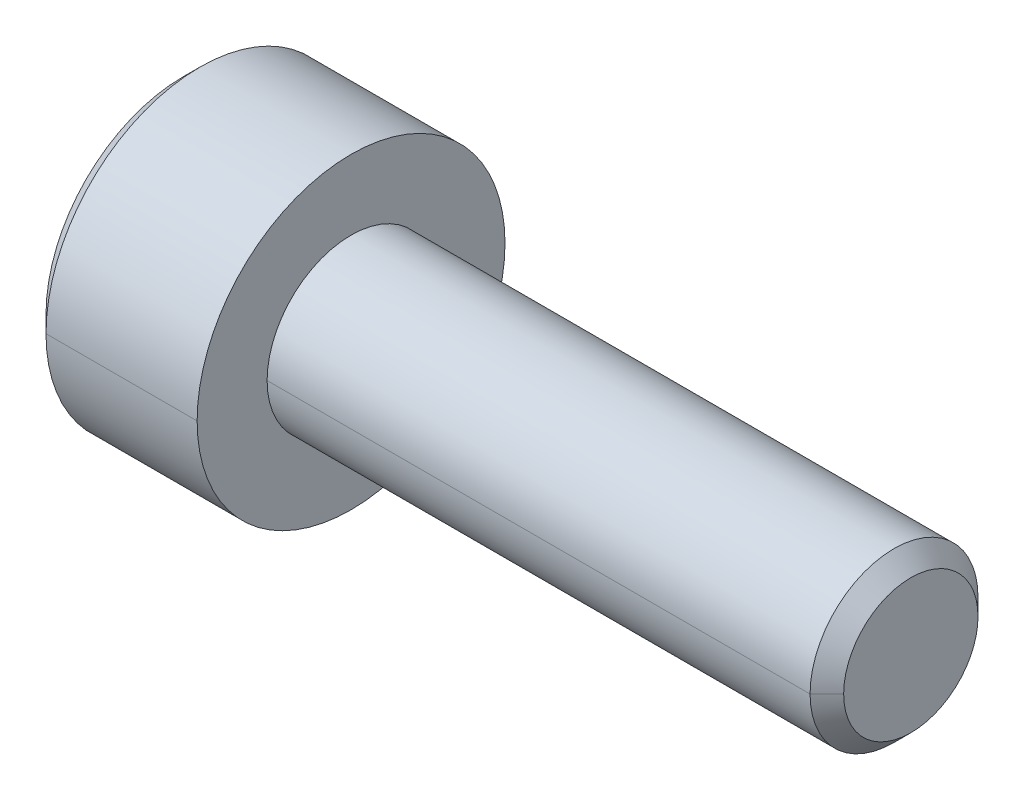
ISO-10303-21;
HEADER;
FILE_DESCRIPTION(('STEP AP214'),'2;1');
FILE_NAME('part.step','',(''),(''),'','','');
FILE_SCHEMA(('AUTOMOTIVE_DESIGN { 1 0 10303 214 1 1 1 1 }'));
ENDSEC;
DATA;
#1=APPLICATION_CONTEXT('core data for automotive mechanical design processes');
#2=APPLICATION_PROTOCOL_DEFINITION('international standard','automotive_design',2000,#1);
#3=PRODUCT_CONTEXT('',#1,'mechanical');
#4=PRODUCT('Part','Part','',(#3));
#5=PRODUCT_RELATED_PRODUCT_CATEGORY('part','',(#4));
#6=PRODUCT_DEFINITION_FORMATION('','',#4);
#7=PRODUCT_DEFINITION_CONTEXT('part definition',#1,'design');
#8=PRODUCT_DEFINITION('design','',#6,#7);
#9=PRODUCT_DEFINITION_SHAPE('','',#8);
#10=(LENGTH_UNIT() NAMED_UNIT(*) SI_UNIT(.MILLI.,.METRE.));
#11=(NAMED_UNIT(*) PLANE_ANGLE_UNIT() SI_UNIT($,.RADIAN.));
#12=(NAMED_UNIT(*) SI_UNIT($,.STERADIAN.) SOLID_ANGLE_UNIT());
#13=UNCERTAINTY_MEASURE_WITH_UNIT(LENGTH_MEASURE(1.E-05),#10,'distance_accuracy_value','');
#14=(GEOMETRIC_REPRESENTATION_CONTEXT(3) GLOBAL_UNCERTAINTY_ASSIGNED_CONTEXT((#13)) GLOBAL_UNIT_ASSIGNED_CONTEXT((#10,
#11,#12)) REPRESENTATION_CONTEXT('',''));
#15=CARTESIAN_POINT('',(0.,0.,0.));
#16=DIRECTION('',(0.,0.,1.));
#17=DIRECTION('',(1.,0.,0.));
#18=AXIS2_PLACEMENT_3D('',#15,#16,#17);
#19=CARTESIAN_POINT('',(-8.85890767230169,3.68257876511719,2.12613784135241));
#20=DIRECTION('',(0.901523057468274,-0.374756097535173,-0.216365533792385));
#21=DIRECTION('',(0.,0.5,-0.866025403784439));
#22=AXIS2_PLACEMENT_3D('',#19,#20,#21);
#23=PLANE('',#22);
#24=DIRECTION('',(0.383848537659809,0.461698034470699,0.799684453457937));
#25=VECTOR('',#24,1.);
#26=CARTESIAN_POINT('',(-11.5,-0.721687836487032,-1.25));
#27=LINE('',#26,#25);
#28=CARTESIAN_POINT('',(-11.5,-0.721687836487032,-1.25));
#29=VERTEX_POINT('',#28);
#30=CARTESIAN_POINT('',(-10.9,0.,0.));
#31=VERTEX_POINT('',#30);
#32=EDGE_CURVE('E159',#29,#31,#27,.T.);
#33=ORIENTED_EDGE('',*,*,#32,.F.);
#34=CARTESIAN_POINT('',(-11.5,-0.721687836487032,-1.25));
#35=CARTESIAN_POINT('',(-11.5,-0.962250448649377,-0.833333333333333));
#36=CARTESIAN_POINT('',(-11.5,-1.20281306081172,-0.416666666666666));
#37=CARTESIAN_POINT('',(-11.5,-1.44337567297406,0.));
#38=(BOUNDED_CURVE() B_SPLINE_CURVE(3,(#34,#35,#36,#37),.UNSPECIFIED.,.F.,
.F.) B_SPLINE_CURVE_WITH_KNOTS((4,4),(0.,1.),
.UNSPECIFIED.) CURVE() GEOMETRIC_REPRESENTATION_ITEM() RATIONAL_B_SPLINE_CURVE((1.,1.,1.,1.)) REPRESENTATION_ITEM(''));
#39=CARTESIAN_POINT('',(-11.5,-1.44337567297406,0.));
#40=VERTEX_POINT('',#39);
#41=EDGE_CURVE('E156',#29,#40,#38,.T.);
#42=ORIENTED_EDGE('',*,*,#41,.T.);
#43=DIRECTION('',(0.383848537659809,0.923396068941397,0.));
#44=VECTOR('',#43,1.);
#45=CARTESIAN_POINT('',(-11.5,-1.44337567297406,0.));
#46=LINE('',#45,#44);
#47=EDGE_CURVE('E10',#40,#31,#46,.T.);
#48=ORIENTED_EDGE('',*,*,#47,.T.);
#49=EDGE_LOOP('',(#33,#42,#48));
#50=FACE_BOUND('',#49,.T.);
#51=ADVANCED_FACE('F16',(#50),#23,.F.);
#52=CARTESIAN_POINT('',(-8.85890767230169,3.68257876511719,-2.12613784135241));
#53=DIRECTION('',(0.901523057468274,-0.374756097535173,0.216365533792385));
#54=DIRECTION('',(0.,-0.5,-0.866025403784439));
#55=AXIS2_PLACEMENT_3D('',#52,#53,#54);
#56=PLANE('',#55);
#57=ORIENTED_EDGE('',*,*,#47,.F.);
#58=CARTESIAN_POINT('',(-11.5,-1.44337567297406,0.));
#59=CARTESIAN_POINT('',(-11.5,-1.20281306081172,0.416666666666667));
#60=CARTESIAN_POINT('',(-11.5,-0.962250448649377,0.833333333333334));
#61=CARTESIAN_POINT('',(-11.5,-0.721687836487033,1.25));
#62=(BOUNDED_CURVE() B_SPLINE_CURVE(3,(#58,#59,#60,#61),.UNSPECIFIED.,.F.,
.F.) B_SPLINE_CURVE_WITH_KNOTS((4,4),(0.,1.),
.UNSPECIFIED.) CURVE() GEOMETRIC_REPRESENTATION_ITEM() RATIONAL_B_SPLINE_CURVE((1.,1.,1.,1.)) REPRESENTATION_ITEM(''));
#63=CARTESIAN_POINT('',(-11.5,-0.721687836487033,1.25));
#64=VERTEX_POINT('',#63);
#65=EDGE_CURVE('E152',#40,#64,#62,.T.);
#66=ORIENTED_EDGE('',*,*,#65,.T.);
#67=DIRECTION('',(0.383848537659809,0.461698034470699,-0.799684453457937));
#68=VECTOR('',#67,1.);
#69=CARTESIAN_POINT('',(-11.5,-0.721687836487033,1.25));
#70=LINE('',#69,#68);
#71=EDGE_CURVE('E26',#64,#31,#70,.T.);
#72=ORIENTED_EDGE('',*,*,#71,.T.);
#73=EDGE_LOOP('',(#57,#66,#72));
#74=FACE_BOUND('',#73,.T.);
#75=ADVANCED_FACE('F150',(#74),#56,.F.);
#76=CARTESIAN_POINT('',(-8.85890767230169,0.,-4.25227568270481));
#77=DIRECTION('',(0.901523057468274,0.,0.432731067584772));
#78=DIRECTION('',(0.,-1.,0.));
#79=AXIS2_PLACEMENT_3D('',#76,#77,#78);
#80=PLANE('',#79);
#81=ORIENTED_EDGE('',*,*,#71,.F.);
#82=CARTESIAN_POINT('',(-11.5,-0.721687836487033,1.25));
#83=CARTESIAN_POINT('',(-11.5,-0.240562612162345,1.25));
#84=CARTESIAN_POINT('',(-11.5,0.240562612162344,1.25));
#85=CARTESIAN_POINT('',(-11.5,0.721687836487033,1.25));
#86=(BOUNDED_CURVE() B_SPLINE_CURVE(3,(#82,#83,#84,#85),.UNSPECIFIED.,.F.,
.F.) B_SPLINE_CURVE_WITH_KNOTS((4,4),(0.,1.),
.UNSPECIFIED.) CURVE() GEOMETRIC_REPRESENTATION_ITEM() RATIONAL_B_SPLINE_CURVE((1.,1.,1.,1.)) REPRESENTATION_ITEM(''));
#87=CARTESIAN_POINT('',(-11.5,0.721687836487033,1.25));
#88=VERTEX_POINT('',#87);
#89=EDGE_CURVE('E185',#64,#88,#86,.T.);
#90=ORIENTED_EDGE('',*,*,#89,.T.);
#91=DIRECTION('',(0.383848537659809,-0.461698034470699,-0.799684453457937));
#92=VECTOR('',#91,1.);
#93=CARTESIAN_POINT('',(-11.5,0.721687836487033,1.25));
#94=LINE('',#93,#92);
#95=EDGE_CURVE('E344',#88,#31,#94,.T.);
#96=ORIENTED_EDGE('',*,*,#95,.T.);
#97=EDGE_LOOP('',(#81,#90,#96));
#98=FACE_BOUND('',#97,.T.);
#99=ADVANCED_FACE('F394',(#98),#80,.F.);
#100=CARTESIAN_POINT('',(-8.85890767230169,-3.68257876511719,-2.12613784135241));
#101=DIRECTION('',(0.901523057468274,0.374756097535173,0.216365533792385));
#102=DIRECTION('',(0.,0.5,-0.866025403784439));
#103=AXIS2_PLACEMENT_3D('',#100,#101,#102);
#104=PLANE('',#103);
#105=ORIENTED_EDGE('',*,*,#95,.F.);
#106=CARTESIAN_POINT('',(-11.5,0.721687836487033,1.25));
#107=CARTESIAN_POINT('',(-11.5,0.962250448649376,0.833333333333333));
#108=CARTESIAN_POINT('',(-11.5,1.20281306081172,0.416666666666666));
#109=CARTESIAN_POINT('',(-11.5,1.44337567297406,0.));
#110=(BOUNDED_CURVE() B_SPLINE_CURVE(3,(#106,#107,#108,#109),.UNSPECIFIED.,.F.,
.F.) B_SPLINE_CURVE_WITH_KNOTS((4,4),(0.,1.),
.UNSPECIFIED.) CURVE() GEOMETRIC_REPRESENTATION_ITEM() RATIONAL_B_SPLINE_CURVE((1.,1.,1.,1.)) REPRESENTATION_ITEM(''));
#111=CARTESIAN_POINT('',(-11.5,1.44337567297406,0.));
#112=VERTEX_POINT('',#111);
#113=EDGE_CURVE('E257',#88,#112,#110,.T.);
#114=ORIENTED_EDGE('',*,*,#113,.T.);
#115=DIRECTION('',(0.383848537659809,-0.923396068941397,0.));
#116=VECTOR('',#115,1.);
#117=CARTESIAN_POINT('',(-11.5,1.44337567297406,0.));
#118=LINE('',#117,#116);
#119=EDGE_CURVE('E206',#112,#31,#118,.T.);
#120=ORIENTED_EDGE('',*,*,#119,.T.);
#121=EDGE_LOOP('',(#105,#114,#120));
#122=FACE_BOUND('',#121,.T.);
#123=ADVANCED_FACE('F402',(#122),#104,.F.);
#124=CARTESIAN_POINT('',(-8.85890767230169,0.,4.25227568270481));
#125=DIRECTION('',(0.901523057468274,0.,-0.432731067584772));
#126=DIRECTION('',(0.,-1.,0.));
#127=AXIS2_PLACEMENT_3D('',#124,#125,#126);
#128=PLANE('',#127);
#129=DIRECTION('',(0.383848537659809,-0.461698034470699,0.799684453457937));
#130=VECTOR('',#129,1.);
#131=CARTESIAN_POINT('',(-11.5,0.721687836487033,-1.25));
#132=LINE('',#131,#130);
#133=CARTESIAN_POINT('',(-11.5,0.721687836487033,-1.25));
#134=VERTEX_POINT('',#133);
#135=EDGE_CURVE('E287',#134,#31,#132,.T.);
#136=ORIENTED_EDGE('',*,*,#135,.F.);
#137=CARTESIAN_POINT('',(-11.5,0.721687836487033,-1.25));
#138=CARTESIAN_POINT('',(-11.5,0.240562612162345,-1.25));
#139=CARTESIAN_POINT('',(-11.5,-0.240562612162344,-1.25));
#140=CARTESIAN_POINT('',(-11.5,-0.721687836487032,-1.25));
#141=(BOUNDED_CURVE() B_SPLINE_CURVE(3,(#137,#138,#139,#140),.UNSPECIFIED.,.F.,
.F.) B_SPLINE_CURVE_WITH_KNOTS((4,4),(0.,1.),
.UNSPECIFIED.) CURVE() GEOMETRIC_REPRESENTATION_ITEM() RATIONAL_B_SPLINE_CURVE((1.,1.,1.,1.)) REPRESENTATION_ITEM(''));
#142=EDGE_CURVE('E222',#134,#29,#141,.T.);
#143=ORIENTED_EDGE('',*,*,#142,.T.);
#144=ORIENTED_EDGE('',*,*,#32,.T.);
#145=EDGE_LOOP('',(#136,#143,#144));
#146=FACE_BOUND('',#145,.T.);
#147=ADVANCED_FACE('F414',(#146),#128,.F.);
#148=CARTESIAN_POINT('',(-8.85890767230169,-3.68257876511719,2.12613784135241));
#149=DIRECTION('',(0.901523057468274,0.374756097535173,-0.216365533792385));
#150=DIRECTION('',(0.,-0.5,-0.866025403784439));
#151=AXIS2_PLACEMENT_3D('',#148,#149,#150);
#152=PLANE('',#151);
#153=ORIENTED_EDGE('',*,*,#119,.F.);
#154=CARTESIAN_POINT('',(-11.5,1.44337567297406,0.));
#155=CARTESIAN_POINT('',(-11.5,1.20281306081172,-0.416666666666667));
#156=CARTESIAN_POINT('',(-11.5,0.962250448649377,-0.833333333333334));
#157=CARTESIAN_POINT('',(-11.5,0.721687836487033,-1.25));
#158=(BOUNDED_CURVE() B_SPLINE_CURVE(3,(#154,#155,#156,#157),.UNSPECIFIED.,.F.,
.F.) B_SPLINE_CURVE_WITH_KNOTS((4,4),(0.,1.),
.UNSPECIFIED.) CURVE() GEOMETRIC_REPRESENTATION_ITEM() RATIONAL_B_SPLINE_CURVE((1.,1.,1.,1.)) REPRESENTATION_ITEM(''));
#159=EDGE_CURVE('E200',#112,#134,#158,.T.);
#160=ORIENTED_EDGE('',*,*,#159,.T.);
#161=ORIENTED_EDGE('',*,*,#135,.T.);
#162=EDGE_LOOP('',(#153,#160,#161));
#163=FACE_BOUND('',#162,.T.);
#164=ADVANCED_FACE('F405',(#163),#152,.F.);
#165=CARTESIAN_POINT('',(-13.,0.,0.));
#166=DIRECTION('',(1.,0.,0.));
#167=DIRECTION('',(0.,0.,-1.));
#168=AXIS2_PLACEMENT_3D('',#165,#166,#167);
#169=CONICAL_SURFACE('',#168,2.45,0.785398163397447);
#170=DIRECTION('',(0.707106781186549,0.,0.707106781186546));
#171=VECTOR('',#170,1.);
#172=CARTESIAN_POINT('',(-13.,0.,2.45));
#173=LINE('',#172,#171);
#174=CARTESIAN_POINT('',(-13.,0.,2.45));
#175=VERTEX_POINT('',#174);
#176=CARTESIAN_POINT('',(-12.7,0.,2.75));
#177=VERTEX_POINT('',#176);
#178=EDGE_CURVE('E235',#175,#177,#173,.T.);
#179=ORIENTED_EDGE('',*,*,#178,.F.);
#180=CARTESIAN_POINT('',(-13.,0.,0.));
#181=DIRECTION('',(-1.,0.,0.));
#182=DIRECTION('',(0.,0.,-1.));
#183=AXIS2_PLACEMENT_3D('',#180,#181,#182);
#184=CIRCLE('',#183,2.45);
#185=CARTESIAN_POINT('',(-13.,0.,-2.45));
#186=VERTEX_POINT('',#185);
#187=EDGE_CURVE('E92',#186,#175,#184,.T.);
#188=ORIENTED_EDGE('',*,*,#187,.F.);
#189=DIRECTION('',(0.707106781186549,0.,-0.707106781186546));
#190=VECTOR('',#189,1.);
#191=CARTESIAN_POINT('',(-13.,0.,-2.45));
#192=LINE('',#191,#190);
#193=CARTESIAN_POINT('',(-12.7,0.,-2.75));
#194=VERTEX_POINT('',#193);
#195=EDGE_CURVE('E250',#186,#194,#192,.T.);
#196=ORIENTED_EDGE('',*,*,#195,.T.);
#197=CARTESIAN_POINT('',(-12.7,0.,0.));
#198=DIRECTION('',(1.,0.,0.));
#199=DIRECTION('',(0.,0.,-1.));
#200=AXIS2_PLACEMENT_3D('',#197,#198,#199);
#201=CIRCLE('',#200,2.75);
#202=EDGE_CURVE('E84',#177,#194,#201,.T.);
#203=ORIENTED_EDGE('',*,*,#202,.F.);
#204=EDGE_LOOP('',(#179,#188,#196,#203));
#205=FACE_BOUND('',#204,.T.);
#206=ADVANCED_FACE('F422',(#205),#169,.T.);
#207=CARTESIAN_POINT('',(-11.5,1.44337567297406,0.));
#208=DIRECTION('',(0.,0.866025403784439,-0.5));
#209=DIRECTION('',(-1.,0.,0.));
#210=AXIS2_PLACEMENT_3D('',#207,#208,#209);
#211=PLANE('',#210);
#212=DIRECTION('',(0.,-0.5,-0.866025403784439));
#213=VECTOR('',#212,1.);
#214=CARTESIAN_POINT('',(-13.,1.44337567297406,0.));
#215=LINE('',#214,#213);
#216=CARTESIAN_POINT('',(-13.,1.44337567297406,0.));
#217=VERTEX_POINT('',#216);
#218=CARTESIAN_POINT('',(-13.,0.721687836487033,-1.25));
#219=VERTEX_POINT('',#218);
#220=EDGE_CURVE('E320',#217,#219,#215,.T.);
#221=ORIENTED_EDGE('',*,*,#220,.T.);
#222=DIRECTION('',(-1.,0.,0.));
#223=VECTOR('',#222,1.);
#224=CARTESIAN_POINT('',(-11.5,0.721687836487033,-1.25));
#225=LINE('',#224,#223);
#226=EDGE_CURVE('E207',#134,#219,#225,.T.);
#227=ORIENTED_EDGE('',*,*,#226,.F.);
#228=ORIENTED_EDGE('',*,*,#159,.F.);
#229=DIRECTION('',(-1.,0.,0.));
#230=VECTOR('',#229,1.);
#231=CARTESIAN_POINT('',(-11.5,1.44337567297406,0.));
#232=LINE('',#231,#230);
#233=EDGE_CURVE('E264',#112,#217,#232,.T.);
#234=ORIENTED_EDGE('',*,*,#233,.T.);
#235=EDGE_LOOP('',(#221,#227,#228,#234));
#236=FACE_BOUND('',#235,.T.);
#237=ADVANCED_FACE('F406',(#236),#211,.F.);
#238=CARTESIAN_POINT('',(-11.5,0.721687836487033,-1.25));
#239=DIRECTION('',(0.,0.,-1.));
#240=DIRECTION('',(0.,-1.,0.));
#241=AXIS2_PLACEMENT_3D('',#238,#239,#240);
#242=PLANE('',#241);
#243=DIRECTION('',(0.,-1.,0.));
#244=VECTOR('',#243,1.);
#245=CARTESIAN_POINT('',(-13.,0.721687836487033,-1.25));
#246=LINE('',#245,#244);
#247=CARTESIAN_POINT('',(-13.,-0.721687836487032,-1.25));
#248=VERTEX_POINT('',#247);
#249=EDGE_CURVE('E286',#219,#248,#246,.T.);
#250=ORIENTED_EDGE('',*,*,#249,.T.);
#251=DIRECTION('',(-1.,0.,0.));
#252=VECTOR('',#251,1.);
#253=CARTESIAN_POINT('',(-11.5,-0.721687836487032,-1.25));
#254=LINE('',#253,#252);
#255=EDGE_CURVE('E163',#29,#248,#254,.T.);
#256=ORIENTED_EDGE('',*,*,#255,.F.);
#257=ORIENTED_EDGE('',*,*,#142,.F.);
#258=ORIENTED_EDGE('',*,*,#226,.T.);
#259=EDGE_LOOP('',(#250,#256,#257,#258));
#260=FACE_BOUND('',#259,.T.);
#261=ADVANCED_FACE('F412',(#260),#242,.F.);
#262=CARTESIAN_POINT('',(-11.5,-0.721687836487032,-1.25));
#263=DIRECTION('',(0.,-0.866025403784439,-0.5));
#264=DIRECTION('',(0.,0.5,-0.866025403784439));
#265=AXIS2_PLACEMENT_3D('',#262,#263,#264);
#266=PLANE('',#265);
#267=DIRECTION('',(0.,-0.5,0.866025403784439));
#268=VECTOR('',#267,1.);
#269=CARTESIAN_POINT('',(-13.,-0.721687836487032,-1.25));
#270=LINE('',#269,#268);
#271=CARTESIAN_POINT('',(-13.,-1.44337567297406,0.));
#272=VERTEX_POINT('',#271);
#273=EDGE_CURVE('E169',#248,#272,#270,.T.);
#274=ORIENTED_EDGE('',*,*,#273,.T.);
#275=DIRECTION('',(-1.,0.,0.));
#276=VECTOR('',#275,1.);
#277=CARTESIAN_POINT('',(-11.5,-1.44337567297406,0.));
#278=LINE('',#277,#276);
#279=EDGE_CURVE('E164',#40,#272,#278,.T.);
#280=ORIENTED_EDGE('',*,*,#279,.F.);
#281=ORIENTED_EDGE('',*,*,#41,.F.);
#282=ORIENTED_EDGE('',*,*,#255,.T.);
#283=EDGE_LOOP('',(#274,#280,#281,#282));
#284=FACE_BOUND('',#283,.T.);
#285=ADVANCED_FACE('F167',(#284),#266,.F.);
#286=CARTESIAN_POINT('',(-11.5,-1.44337567297406,0.));
#287=DIRECTION('',(0.,-0.866025403784439,0.5));
#288=DIRECTION('',(-1.,0.,0.));
#289=AXIS2_PLACEMENT_3D('',#286,#287,#288);
#290=PLANE('',#289);
#291=DIRECTION('',(0.,0.5,0.866025403784439));
#292=VECTOR('',#291,1.);
#293=CARTESIAN_POINT('',(-13.,-1.44337567297406,0.));
#294=LINE('',#293,#292);
#295=CARTESIAN_POINT('',(-13.,-0.721687836487033,1.25));
#296=VERTEX_POINT('',#295);
#297=EDGE_CURVE('E216',#272,#296,#294,.T.);
#298=ORIENTED_EDGE('',*,*,#297,.T.);
#299=DIRECTION('',(-1.,0.,0.));
#300=VECTOR('',#299,1.);
#301=CARTESIAN_POINT('',(-11.5,-0.721687836487033,1.25));
#302=LINE('',#301,#300);
#303=EDGE_CURVE('E176',#64,#296,#302,.T.);
#304=ORIENTED_EDGE('',*,*,#303,.F.);
#305=ORIENTED_EDGE('',*,*,#65,.F.);
#306=ORIENTED_EDGE('',*,*,#279,.T.);
#307=EDGE_LOOP('',(#298,#304,#305,#306));
#308=FACE_BOUND('',#307,.T.);
#309=ADVANCED_FACE('F175',(#308),#290,.F.);
#310=CARTESIAN_POINT('',(-11.5,-0.721687836487033,1.25));
#311=DIRECTION('',(0.,0.,1.));
#312=DIRECTION('',(1.,0.,0.));
#313=AXIS2_PLACEMENT_3D('',#310,#311,#312);
#314=PLANE('',#313);
#315=DIRECTION('',(0.,1.,0.));
#316=VECTOR('',#315,1.);
#317=CARTESIAN_POINT('',(-13.,-0.721687836487033,1.25));
#318=LINE('',#317,#316);
#319=CARTESIAN_POINT('',(-13.,0.721687836487033,1.25));
#320=VERTEX_POINT('',#319);
#321=EDGE_CURVE('E219',#296,#320,#318,.T.);
#322=ORIENTED_EDGE('',*,*,#321,.T.);
#323=DIRECTION('',(-1.,0.,0.));
#324=VECTOR('',#323,1.);
#325=CARTESIAN_POINT('',(-11.5,0.721687836487033,1.25));
#326=LINE('',#325,#324);
#327=EDGE_CURVE('E263',#88,#320,#326,.T.);
#328=ORIENTED_EDGE('',*,*,#327,.F.);
#329=ORIENTED_EDGE('',*,*,#89,.F.);
#330=ORIENTED_EDGE('',*,*,#303,.T.);
#331=EDGE_LOOP('',(#322,#328,#329,#330));
#332=FACE_BOUND('',#331,.T.);
#333=ADVANCED_FACE('F396',(#332),#314,.F.);
#334=CARTESIAN_POINT('',(-11.5,0.721687836487033,1.25));
#335=DIRECTION('',(0.,0.866025403784439,0.5));
#336=DIRECTION('',(1.,0.,0.));
#337=AXIS2_PLACEMENT_3D('',#334,#335,#336);
#338=PLANE('',#337);
#339=DIRECTION('',(0.,0.5,-0.866025403784439));
#340=VECTOR('',#339,1.);
#341=CARTESIAN_POINT('',(-13.,0.721687836487033,1.25));
#342=LINE('',#341,#340);
#343=EDGE_CURVE('E322',#320,#217,#342,.T.);
#344=ORIENTED_EDGE('',*,*,#343,.T.);
#345=ORIENTED_EDGE('',*,*,#233,.F.);
#346=ORIENTED_EDGE('',*,*,#113,.F.);
#347=ORIENTED_EDGE('',*,*,#327,.T.);
#348=EDGE_LOOP('',(#344,#345,#346,#347));
#349=FACE_BOUND('',#348,.T.);
#350=ADVANCED_FACE('F400',(#349),#338,.F.);
#351=CARTESIAN_POINT('',(-0.300000000000003,0.,0.));
#352=DIRECTION('',(-1.,0.,0.));
#353=DIRECTION('',(0.,0.,1.));
#354=AXIS2_PLACEMENT_3D('',#351,#352,#353);
#355=CONICAL_SURFACE('',#354,1.5,0.785398163397451);
#356=DIRECTION('',(-0.707106781186546,0.,-0.70710678118655));
#357=VECTOR('',#356,1.);
#358=CARTESIAN_POINT('',(-0.300000000000003,0.,-1.5));
#359=LINE('',#358,#357);
#360=CARTESIAN_POINT('',(0.,0.,-1.2));
#361=VERTEX_POINT('',#360);
#362=CARTESIAN_POINT('',(-0.300000000000003,0.,-1.5));
#363=VERTEX_POINT('',#362);
#364=EDGE_CURVE('E228',#361,#363,#359,.T.);
#365=ORIENTED_EDGE('',*,*,#364,.F.);
#366=CARTESIAN_POINT('',(0.,0.,0.));
#367=DIRECTION('',(1.,0.,0.));
#368=DIRECTION('',(0.,0.,1.));
#369=AXIS2_PLACEMENT_3D('',#366,#367,#368);
#370=CIRCLE('',#369,1.2);
#371=CARTESIAN_POINT('',(0.,0.,1.2));
#372=VERTEX_POINT('',#371);
#373=EDGE_CURVE('E232',#372,#361,#370,.T.);
#374=ORIENTED_EDGE('',*,*,#373,.F.);
#375=DIRECTION('',(-0.707106781186546,0.,0.70710678118655));
#376=VECTOR('',#375,1.);
#377=CARTESIAN_POINT('',(-0.300000000000003,0.,1.5));
#378=LINE('',#377,#376);
#379=CARTESIAN_POINT('',(-0.300000000000003,0.,1.5));
#380=VERTEX_POINT('',#379);
#381=EDGE_CURVE('E227',#372,#380,#378,.T.);
#382=ORIENTED_EDGE('',*,*,#381,.T.);
#383=CARTESIAN_POINT('',(-0.300000000000003,0.,0.));
#384=DIRECTION('',(-1.,0.,0.));
#385=DIRECTION('',(0.,0.,1.));
#386=AXIS2_PLACEMENT_3D('',#383,#384,#385);
#387=CIRCLE('',#386,1.5);
#388=EDGE_CURVE('E229',#363,#380,#387,.T.);
#389=ORIENTED_EDGE('',*,*,#388,.F.);
#390=EDGE_LOOP('',(#365,#374,#382,#389));
#391=FACE_BOUND('',#390,.T.);
#392=ADVANCED_FACE('F301',(#391),#355,.T.);
#393=CARTESIAN_POINT('',(-13.,2.75,0.));
#394=DIRECTION('',(1.,0.,0.));
#395=DIRECTION('',(0.,1.,0.));
#396=AXIS2_PLACEMENT_3D('',#393,#394,#395);
#397=PLANE('',#396);
#398=ORIENTED_EDGE('',*,*,#220,.F.);
#399=ORIENTED_EDGE('',*,*,#343,.F.);
#400=ORIENTED_EDGE('',*,*,#321,.F.);
#401=ORIENTED_EDGE('',*,*,#297,.F.);
#402=ORIENTED_EDGE('',*,*,#273,.F.);
#403=ORIENTED_EDGE('',*,*,#249,.F.);
#404=EDGE_LOOP('',(#398,#399,#400,#401,#402,#403));
#405=FACE_BOUND('',#404,.T.);
#406=ORIENTED_EDGE('',*,*,#187,.T.);
#407=CARTESIAN_POINT('',(-13.,0.,0.));
#408=DIRECTION('',(-1.,0.,0.));
#409=DIRECTION('',(0.,0.,-1.));
#410=AXIS2_PLACEMENT_3D('',#407,#408,#409);
#411=CIRCLE('',#410,2.45);
#412=EDGE_CURVE('E233',#175,#186,#411,.T.);
#413=ORIENTED_EDGE('',*,*,#412,.T.);
#414=EDGE_LOOP('',(#406,#413));
#415=FACE_BOUND('',#414,.T.);
#416=ADVANCED_FACE('F436',(#405,#415),#397,.F.);
#417=CARTESIAN_POINT('',(0.,0.,0.));
#418=DIRECTION('',(-1.,0.,0.));
#419=DIRECTION('',(0.,0.,1.));
#420=AXIS2_PLACEMENT_3D('',#417,#418,#419);
#421=CYLINDRICAL_SURFACE('',#420,2.75);
#422=DIRECTION('',(-1.,0.,0.));
#423=VECTOR('',#422,1.);
#424=CARTESIAN_POINT('',(0.,0.,-2.75));
#425=LINE('',#424,#423);
#426=CARTESIAN_POINT('',(-10.,0.,-2.75));
#427=VERTEX_POINT('',#426);
#428=EDGE_CURVE('E208',#427,#194,#425,.T.);
#429=ORIENTED_EDGE('',*,*,#428,.F.);
#430=CARTESIAN_POINT('',(-10.,0.,0.));
#431=DIRECTION('',(-1.,0.,0.));
#432=DIRECTION('',(0.,0.,1.));
#433=AXIS2_PLACEMENT_3D('',#430,#431,#432);
#434=CIRCLE('',#433,2.75);
#435=CARTESIAN_POINT('',(-10.,0.,2.75));
#436=VERTEX_POINT('',#435);
#437=EDGE_CURVE('E265',#427,#436,#434,.T.);
#438=ORIENTED_EDGE('',*,*,#437,.T.);
#439=DIRECTION('',(-1.,0.,0.));
#440=VECTOR('',#439,1.);
#441=CARTESIAN_POINT('',(0.,0.,2.75));
#442=LINE('',#441,#440);
#443=EDGE_CURVE('E19',#436,#177,#442,.T.);
#444=ORIENTED_EDGE('',*,*,#443,.T.);
#445=ORIENTED_EDGE('',*,*,#202,.T.);
#446=EDGE_LOOP('',(#429,#438,#444,#445));
#447=FACE_BOUND('',#446,.T.);
#448=ADVANCED_FACE('F365',(#447),#421,.T.);
#449=CARTESIAN_POINT('',(-10.,1.5,0.));
#450=DIRECTION('',(-1.,0.,0.));
#451=DIRECTION('',(0.,0.,1.));
#452=AXIS2_PLACEMENT_3D('',#449,#450,#451);
#453=PLANE('',#452);
#454=CARTESIAN_POINT('',(-10.,0.,0.));
#455=DIRECTION('',(-1.,0.,0.));
#456=DIRECTION('',(0.,0.,1.));
#457=AXIS2_PLACEMENT_3D('',#454,#455,#456);
#458=CIRCLE('',#457,1.5);
#459=CARTESIAN_POINT('',(-10.,0.,1.5));
#460=VERTEX_POINT('',#459);
#461=CARTESIAN_POINT('',(-10.,0.,-1.5));
#462=VERTEX_POINT('',#461);
#463=EDGE_CURVE('E198',#460,#462,#458,.T.);
#464=ORIENTED_EDGE('',*,*,#463,.T.);
#465=CARTESIAN_POINT('',(-10.,0.,0.));
#466=DIRECTION('',(-1.,0.,0.));
#467=DIRECTION('',(0.,0.,1.));
#468=AXIS2_PLACEMENT_3D('',#465,#466,#467);
#469=CIRCLE('',#468,1.5);
#470=EDGE_CURVE('E231',#462,#460,#469,.T.);
#471=ORIENTED_EDGE('',*,*,#470,.T.);
#472=EDGE_LOOP('',(#464,#471));
#473=FACE_BOUND('',#472,.T.);
#474=CARTESIAN_POINT('',(-10.,0.,0.));
#475=DIRECTION('',(-1.,0.,0.));
#476=DIRECTION('',(0.,0.,1.));
#477=AXIS2_PLACEMENT_3D('',#474,#475,#476);
#478=CIRCLE('',#477,2.75);
#479=EDGE_CURVE('E215',#436,#427,#478,.T.);
#480=ORIENTED_EDGE('',*,*,#479,.F.);
#481=ORIENTED_EDGE('',*,*,#437,.F.);
#482=EDGE_LOOP('',(#480,#481));
#483=FACE_BOUND('',#482,.T.);
#484=ADVANCED_FACE('F362',(#473,#483),#453,.F.);
#485=CARTESIAN_POINT('',(0.,0.,0.));
#486=DIRECTION('',(-1.,0.,0.));
#487=DIRECTION('',(0.,0.,1.));
#488=AXIS2_PLACEMENT_3D('',#485,#486,#487);
#489=CYLINDRICAL_SURFACE('',#488,1.5);
#490=DIRECTION('',(-1.,0.,0.));
#491=VECTOR('',#490,1.);
#492=CARTESIAN_POINT('',(0.,0.,-1.5));
#493=LINE('',#492,#491);
#494=EDGE_CURVE('E193',#363,#462,#493,.T.);
#495=ORIENTED_EDGE('',*,*,#494,.F.);
#496=ORIENTED_EDGE('',*,*,#388,.T.);
#497=DIRECTION('',(-1.,0.,0.));
#498=VECTOR('',#497,1.);
#499=CARTESIAN_POINT('',(0.,0.,1.5));
#500=LINE('',#499,#498);
#501=EDGE_CURVE('E271',#380,#460,#500,.T.);
#502=ORIENTED_EDGE('',*,*,#501,.T.);
#503=ORIENTED_EDGE('',*,*,#470,.F.);
#504=EDGE_LOOP('',(#495,#496,#502,#503));
#505=FACE_BOUND('',#504,.T.);
#506=ADVANCED_FACE('F306',(#505),#489,.T.);
#507=CARTESIAN_POINT('',(0.,0.,0.));
#508=DIRECTION('',(-1.,0.,0.));
#509=DIRECTION('',(0.,0.,1.));
#510=AXIS2_PLACEMENT_3D('',#507,#508,#509);
#511=PLANE('',#510);
#512=ORIENTED_EDGE('',*,*,#373,.T.);
#513=CARTESIAN_POINT('',(0.,0.,0.));
#514=DIRECTION('',(1.,0.,0.));
#515=DIRECTION('',(0.,0.,1.));
#516=AXIS2_PLACEMENT_3D('',#513,#514,#515);
#517=CIRCLE('',#516,1.2);
#518=EDGE_CURVE('E254',#361,#372,#517,.T.);
#519=ORIENTED_EDGE('',*,*,#518,.T.);
#520=EDGE_LOOP('',(#512,#519));
#521=FACE_BOUND('',#520,.T.);
#522=ADVANCED_FACE('F442',(#521),#511,.F.);
#523=CARTESIAN_POINT('',(0.,0.,0.));
#524=DIRECTION('',(-1.,0.,0.));
#525=DIRECTION('',(0.,0.,1.));
#526=AXIS2_PLACEMENT_3D('',#523,#524,#525);
#527=CYLINDRICAL_SURFACE('',#526,1.5);
#528=CARTESIAN_POINT('',(-0.300000000000003,0.,0.));
#529=DIRECTION('',(-1.,0.,0.));
#530=DIRECTION('',(0.,0.,1.));
#531=AXIS2_PLACEMENT_3D('',#528,#529,#530);
#532=CIRCLE('',#531,1.5);
#533=EDGE_CURVE('E223',#380,#363,#532,.T.);
#534=ORIENTED_EDGE('',*,*,#533,.T.);
#535=ORIENTED_EDGE('',*,*,#494,.T.);
#536=ORIENTED_EDGE('',*,*,#463,.F.);
#537=ORIENTED_EDGE('',*,*,#501,.F.);
#538=EDGE_LOOP('',(#534,#535,#536,#537));
#539=FACE_BOUND('',#538,.T.);
#540=ADVANCED_FACE('F310',(#539),#527,.T.);
#541=CARTESIAN_POINT('',(0.,0.,0.));
#542=DIRECTION('',(-1.,0.,0.));
#543=DIRECTION('',(0.,0.,1.));
#544=AXIS2_PLACEMENT_3D('',#541,#542,#543);
#545=CYLINDRICAL_SURFACE('',#544,2.75);
#546=ORIENTED_EDGE('',*,*,#479,.T.);
#547=ORIENTED_EDGE('',*,*,#428,.T.);
#548=CARTESIAN_POINT('',(-12.7,0.,0.));
#549=DIRECTION('',(1.,0.,0.));
#550=DIRECTION('',(0.,0.,-1.));
#551=AXIS2_PLACEMENT_3D('',#548,#549,#550);
#552=CIRCLE('',#551,2.75);
#553=EDGE_CURVE('E191',#194,#177,#552,.T.);
#554=ORIENTED_EDGE('',*,*,#553,.T.);
#555=ORIENTED_EDGE('',*,*,#443,.F.);
#556=EDGE_LOOP('',(#546,#547,#554,#555));
#557=FACE_BOUND('',#556,.T.);
#558=ADVANCED_FACE('F435',(#557),#545,.T.);
#559=CARTESIAN_POINT('',(-0.300000000000003,0.,0.));
#560=DIRECTION('',(-1.,0.,0.));
#561=DIRECTION('',(0.,0.,1.));
#562=AXIS2_PLACEMENT_3D('',#559,#560,#561);
#563=CONICAL_SURFACE('',#562,1.5,0.785398163397451);
#564=ORIENTED_EDGE('',*,*,#518,.F.);
#565=ORIENTED_EDGE('',*,*,#364,.T.);
#566=ORIENTED_EDGE('',*,*,#533,.F.);
#567=ORIENTED_EDGE('',*,*,#381,.F.);
#568=EDGE_LOOP('',(#564,#565,#566,#567));
#569=FACE_BOUND('',#568,.T.);
#570=ADVANCED_FACE('F298',(#569),#563,.T.);
#571=CARTESIAN_POINT('',(-13.,0.,0.));
#572=DIRECTION('',(1.,0.,0.));
#573=DIRECTION('',(0.,0.,-1.));
#574=AXIS2_PLACEMENT_3D('',#571,#572,#573);
#575=CONICAL_SURFACE('',#574,2.45,0.785398163397447);
#576=ORIENTED_EDGE('',*,*,#412,.F.);
#577=ORIENTED_EDGE('',*,*,#178,.T.);
#578=ORIENTED_EDGE('',*,*,#553,.F.);
#579=ORIENTED_EDGE('',*,*,#195,.F.);
#580=EDGE_LOOP('',(#576,#577,#578,#579));
#581=FACE_BOUND('',#580,.T.);
#582=ADVANCED_FACE('F449',(#581),#575,.T.);
#583=CLOSED_SHELL('',(#51,#75,#99,#123,#147,#164,#206,#237,#261,#285,#309,#333,#350,#392,#416,
#448,#484,#506,#522,#540,#558,#570,#582));
#584=MANIFOLD_SOLID_BREP('B1',#583);
#585=ADVANCED_BREP_SHAPE_REPRESENTATION('',(#18,#584),#14);
#586=SHAPE_DEFINITION_REPRESENTATION(#9,#585);
ENDSEC;
END-ISO-10303-21;
